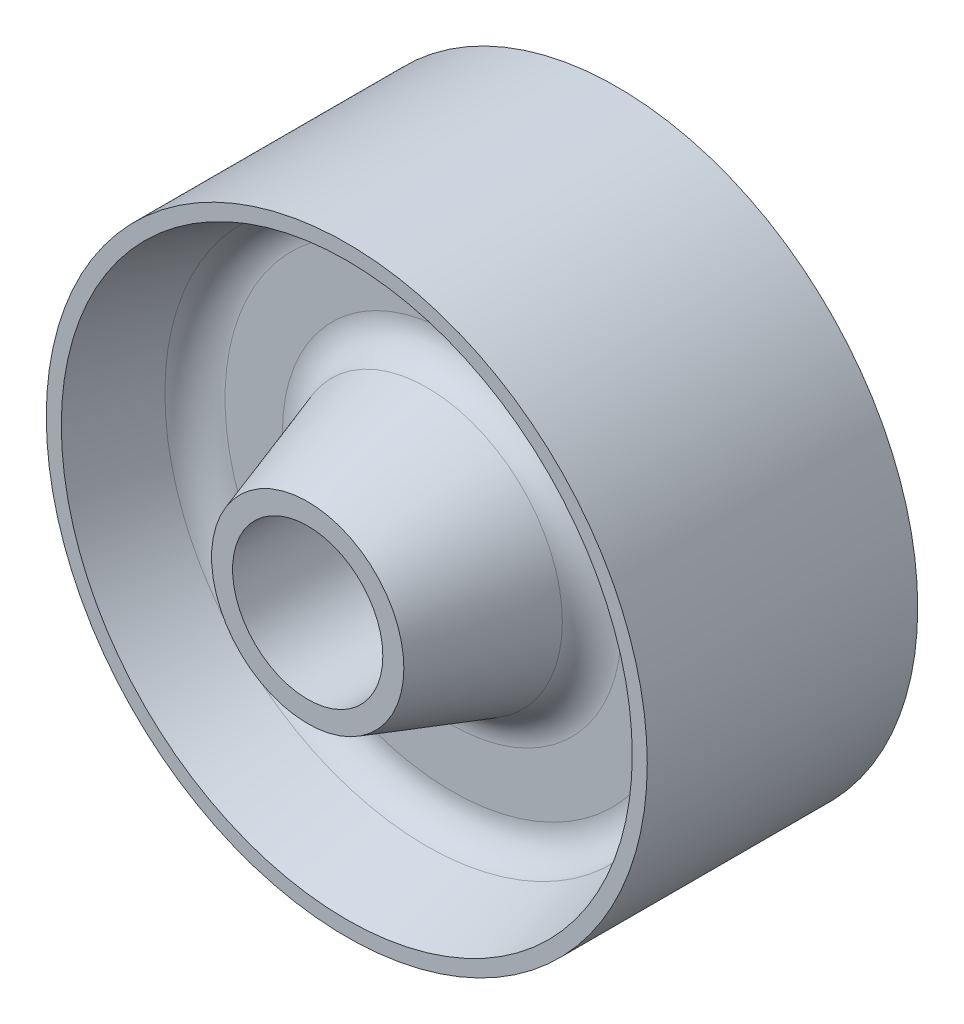
ISO-10303-21;
HEADER;
FILE_DESCRIPTION(('STEP AP214'),'2;1');
FILE_NAME('part.step','',(''),(''),'','','');
FILE_SCHEMA(('AUTOMOTIVE_DESIGN { 1 0 10303 214 1 1 1 1 }'));
ENDSEC;
DATA;
#1=APPLICATION_CONTEXT('core data for automotive mechanical design processes');
#2=APPLICATION_PROTOCOL_DEFINITION('international standard','automotive_design',2000,#1);
#3=PRODUCT_CONTEXT('',#1,'mechanical');
#4=PRODUCT('Part','Part','',(#3));
#5=PRODUCT_RELATED_PRODUCT_CATEGORY('part','',(#4));
#6=PRODUCT_DEFINITION_FORMATION('','',#4);
#7=PRODUCT_DEFINITION_CONTEXT('part definition',#1,'design');
#8=PRODUCT_DEFINITION('design','',#6,#7);
#9=PRODUCT_DEFINITION_SHAPE('','',#8);
#10=(LENGTH_UNIT() NAMED_UNIT(*) SI_UNIT(.MILLI.,.METRE.));
#11=(NAMED_UNIT(*) PLANE_ANGLE_UNIT() SI_UNIT($,.RADIAN.));
#12=(NAMED_UNIT(*) SI_UNIT($,.STERADIAN.) SOLID_ANGLE_UNIT());
#13=UNCERTAINTY_MEASURE_WITH_UNIT(LENGTH_MEASURE(1.E-05),#10,'distance_accuracy_value','');
#14=(GEOMETRIC_REPRESENTATION_CONTEXT(3) GLOBAL_UNCERTAINTY_ASSIGNED_CONTEXT((#13)) GLOBAL_UNIT_ASSIGNED_CONTEXT((#10,
#11,#12)) REPRESENTATION_CONTEXT('',''));
#15=CARTESIAN_POINT('',(0.,0.,0.));
#16=DIRECTION('',(0.,0.,1.));
#17=DIRECTION('',(1.,0.,0.));
#18=AXIS2_PLACEMENT_3D('',#15,#16,#17);
#19=CARTESIAN_POINT('',(0.,47.5,22.5));
#20=DIRECTION('',(0.,0.,-1.));
#21=DIRECTION('',(-1.,0.,0.));
#22=AXIS2_PLACEMENT_3D('',#19,#20,#21);
#23=PLANE('',#22);
#24=CARTESIAN_POINT('',(0.,0.,22.5));
#25=DIRECTION('',(0.,0.,1.));
#26=DIRECTION('',(1.,0.,0.));
#27=AXIS2_PLACEMENT_3D('',#24,#25,#26);
#28=CIRCLE('',#27,47.5);
#29=CARTESIAN_POINT('',(47.5,0.,22.5));
#30=VERTEX_POINT('',#29);
#31=EDGE_CURVE('E87',#30,#30,#28,.T.);
#32=ORIENTED_EDGE('',*,*,#31,.F.);
#33=EDGE_LOOP('',(#32));
#34=FACE_BOUND('',#33,.T.);
#35=CARTESIAN_POINT('',(0.,0.,22.5));
#36=DIRECTION('',(0.,0.,1.));
#37=DIRECTION('',(1.,0.,0.));
#38=AXIS2_PLACEMENT_3D('',#35,#36,#37);
#39=CIRCLE('',#38,50.);
#40=CARTESIAN_POINT('',(50.,0.,22.5));
#41=VERTEX_POINT('',#40);
#42=EDGE_CURVE('E10',#41,#41,#39,.T.);
#43=ORIENTED_EDGE('',*,*,#42,.T.);
#44=EDGE_LOOP('',(#43));
#45=FACE_BOUND('',#44,.T.);
#46=ADVANCED_FACE('F35',(#34,#45),#23,.F.);
#47=CARTESIAN_POINT('',(0.,0.,41.4443571183496));
#48=DIRECTION('',(0.,0.,1.));
#49=DIRECTION('',(1.,0.,0.));
#50=AXIS2_PLACEMENT_3D('',#47,#48,#49);
#51=CYLINDRICAL_SURFACE('',#50,50.);
#52=ORIENTED_EDGE('',*,*,#42,.F.);
#53=EDGE_LOOP('',(#52));
#54=FACE_BOUND('',#53,.T.);
#55=CARTESIAN_POINT('',(0.,0.,-22.5));
#56=DIRECTION('',(0.,0.,1.));
#57=DIRECTION('',(1.,0.,0.));
#58=AXIS2_PLACEMENT_3D('',#55,#56,#57);
#59=CIRCLE('',#58,50.);
#60=CARTESIAN_POINT('',(50.,0.,-22.5));
#61=VERTEX_POINT('',#60);
#62=EDGE_CURVE('E41',#61,#61,#59,.T.);
#63=ORIENTED_EDGE('',*,*,#62,.T.);
#64=EDGE_LOOP('',(#63));
#65=FACE_BOUND('',#64,.T.);
#66=ADVANCED_FACE('F94',(#54,#65),#51,.T.);
#67=CARTESIAN_POINT('',(0.,50.,-22.5));
#68=DIRECTION('',(0.,0.,1.));
#69=DIRECTION('',(1.,0.,0.));
#70=AXIS2_PLACEMENT_3D('',#67,#68,#69);
#71=PLANE('',#70);
#72=ORIENTED_EDGE('',*,*,#62,.F.);
#73=EDGE_LOOP('',(#72));
#74=FACE_BOUND('',#73,.T.);
#75=CARTESIAN_POINT('',(0.,0.,-22.5));
#76=DIRECTION('',(0.,0.,1.));
#77=DIRECTION('',(1.,0.,0.));
#78=AXIS2_PLACEMENT_3D('',#75,#76,#77);
#79=CIRCLE('',#78,47.5);
#80=CARTESIAN_POINT('',(47.5,0.,-22.5));
#81=VERTEX_POINT('',#80);
#82=EDGE_CURVE('E45',#81,#81,#79,.T.);
#83=ORIENTED_EDGE('',*,*,#82,.T.);
#84=EDGE_LOOP('',(#83));
#85=FACE_BOUND('',#84,.T.);
#86=ADVANCED_FACE('F98',(#74,#85),#71,.F.);
#87=CARTESIAN_POINT('',(0.,0.,-9.26426044901074));
#88=DIRECTION('',(0.,0.,-1.));
#89=DIRECTION('',(-1.,0.,0.));
#90=AXIS2_PLACEMENT_3D('',#87,#88,#89);
#91=CONICAL_SURFACE('',#90,43.5,0.293484961753605);
#92=ORIENTED_EDGE('',*,*,#82,.F.);
#93=EDGE_LOOP('',(#92));
#94=FACE_BOUND('',#93,.T.);
#95=CARTESIAN_POINT('',(0.,0.,-9.26426044901074));
#96=DIRECTION('',(0.,0.,1.));
#97=DIRECTION('',(1.,0.,0.));
#98=AXIS2_PLACEMENT_3D('',#95,#96,#97);
#99=CIRCLE('',#98,43.5);
#100=CARTESIAN_POINT('',(43.5,0.,-9.26426044901074));
#101=VERTEX_POINT('',#100);
#102=EDGE_CURVE('E49',#101,#101,#99,.T.);
#103=ORIENTED_EDGE('',*,*,#102,.T.);
#104=EDGE_LOOP('',(#103));
#105=FACE_BOUND('',#104,.T.);
#106=ADVANCED_FACE('F103',(#94,#105),#91,.F.);
#107=CARTESIAN_POINT('',(0.,0.,-11.));
#108=DIRECTION('',(0.,0.,1.));
#109=DIRECTION('',(1.,0.,0.));
#110=AXIS2_PLACEMENT_3D('',#107,#108,#109);
#111=TOROIDAL_SURFACE('',#110,37.7565508436888,6.);
#112=ORIENTED_EDGE('',*,*,#102,.F.);
#113=EDGE_LOOP('',(#112));
#114=FACE_BOUND('',#113,.T.);
#115=CARTESIAN_POINT('',(0.,0.,-4.99999999999999));
#116=DIRECTION('',(0.,0.,1.));
#117=DIRECTION('',(1.,0.,0.));
#118=AXIS2_PLACEMENT_3D('',#115,#116,#117);
#119=CIRCLE('',#118,37.7565508436888);
#120=CARTESIAN_POINT('',(37.7565508436888,0.,-4.99999999999999));
#121=VERTEX_POINT('',#120);
#122=EDGE_CURVE('E54',#121,#121,#119,.T.);
#123=ORIENTED_EDGE('',*,*,#122,.T.);
#124=EDGE_LOOP('',(#123));
#125=FACE_BOUND('',#124,.T.);
#126=ADVANCED_FACE('F109',(#114,#125),#111,.F.);
#127=CARTESIAN_POINT('',(0.,37.7565508436888,-5.));
#128=DIRECTION('',(0.,0.,1.));
#129=DIRECTION('',(1.,0.,0.));
#130=AXIS2_PLACEMENT_3D('',#127,#128,#129);
#131=PLANE('',#130);
#132=ORIENTED_EDGE('',*,*,#122,.F.);
#133=EDGE_LOOP('',(#132));
#134=FACE_BOUND('',#133,.T.);
#135=CARTESIAN_POINT('',(0.,0.,-5.));
#136=DIRECTION('',(0.,0.,1.));
#137=DIRECTION('',(1.,0.,0.));
#138=AXIS2_PLACEMENT_3D('',#135,#136,#137);
#139=CIRCLE('',#138,28.2025139085379);
#140=CARTESIAN_POINT('',(28.2025139085379,0.,-5.));
#141=VERTEX_POINT('',#140);
#142=EDGE_CURVE('E57',#141,#141,#139,.T.);
#143=ORIENTED_EDGE('',*,*,#142,.T.);
#144=EDGE_LOOP('',(#143));
#145=FACE_BOUND('',#144,.T.);
#146=ADVANCED_FACE('F113',(#134,#145),#131,.F.);
#147=CARTESIAN_POINT('',(0.,0.,-11.));
#148=DIRECTION('',(0.,0.,1.));
#149=DIRECTION('',(1.,0.,0.));
#150=AXIS2_PLACEMENT_3D('',#147,#148,#149);
#151=TOROIDAL_SURFACE('',#150,28.2025139085379,6.);
#152=ORIENTED_EDGE('',*,*,#142,.F.);
#153=EDGE_LOOP('',(#152));
#154=FACE_BOUND('',#153,.T.);
#155=CARTESIAN_POINT('',(0.,0.,-9.13416637319086));
#156=DIRECTION('',(0.,0.,1.));
#157=DIRECTION('',(1.,0.,0.));
#158=AXIS2_PLACEMENT_3D('',#155,#156,#157);
#159=CIRCLE('',#158,22.5);
#160=CARTESIAN_POINT('',(22.5,0.,-9.13416637319086));
#161=VERTEX_POINT('',#160);
#162=EDGE_CURVE('E60',#161,#161,#159,.T.);
#163=ORIENTED_EDGE('',*,*,#162,.T.);
#164=EDGE_LOOP('',(#163));
#165=FACE_BOUND('',#164,.T.);
#166=ADVANCED_FACE('F117',(#154,#165),#151,.F.);
#167=CARTESIAN_POINT('',(0.,0.,-29.));
#168=DIRECTION('',(0.,0.,1.));
#169=DIRECTION('',(1.,0.,0.));
#170=AXIS2_PLACEMENT_3D('',#167,#168,#169);
#171=CONICAL_SURFACE('',#170,16.,0.316215853592344);
#172=ORIENTED_EDGE('',*,*,#162,.F.);
#173=EDGE_LOOP('',(#172));
#174=FACE_BOUND('',#173,.T.);
#175=CARTESIAN_POINT('',(0.,0.,-29.));
#176=DIRECTION('',(0.,0.,1.));
#177=DIRECTION('',(1.,0.,0.));
#178=AXIS2_PLACEMENT_3D('',#175,#176,#177);
#179=CIRCLE('',#178,16.);
#180=CARTESIAN_POINT('',(16.,0.,-29.));
#181=VERTEX_POINT('',#180);
#182=EDGE_CURVE('E63',#181,#181,#179,.T.);
#183=ORIENTED_EDGE('',*,*,#182,.T.);
#184=EDGE_LOOP('',(#183));
#185=FACE_BOUND('',#184,.T.);
#186=ADVANCED_FACE('F121',(#174,#185),#171,.T.);
#187=CARTESIAN_POINT('',(0.,16.,-29.));
#188=DIRECTION('',(0.,0.,1.));
#189=DIRECTION('',(1.,0.,0.));
#190=AXIS2_PLACEMENT_3D('',#187,#188,#189);
#191=PLANE('',#190);
#192=ORIENTED_EDGE('',*,*,#182,.F.);
#193=EDGE_LOOP('',(#192));
#194=FACE_BOUND('',#193,.T.);
#195=CARTESIAN_POINT('',(0.,0.,-29.));
#196=DIRECTION('',(0.,0.,1.));
#197=DIRECTION('',(1.,0.,0.));
#198=AXIS2_PLACEMENT_3D('',#195,#196,#197);
#199=CIRCLE('',#198,12.5);
#200=CARTESIAN_POINT('',(12.5,0.,-29.));
#201=VERTEX_POINT('',#200);
#202=EDGE_CURVE('E66',#201,#201,#199,.T.);
#203=ORIENTED_EDGE('',*,*,#202,.T.);
#204=EDGE_LOOP('',(#203));
#205=FACE_BOUND('',#204,.T.);
#206=ADVANCED_FACE('F125',(#194,#205),#191,.F.);
#207=CARTESIAN_POINT('',(0.,0.,41.4443571183496));
#208=DIRECTION('',(0.,0.,1.));
#209=DIRECTION('',(1.,0.,0.));
#210=AXIS2_PLACEMENT_3D('',#207,#208,#209);
#211=CYLINDRICAL_SURFACE('',#210,12.5);
#212=ORIENTED_EDGE('',*,*,#202,.F.);
#213=EDGE_LOOP('',(#212));
#214=FACE_BOUND('',#213,.T.);
#215=CARTESIAN_POINT('',(0.,0.,29.));
#216=DIRECTION('',(0.,0.,1.));
#217=DIRECTION('',(1.,0.,0.));
#218=AXIS2_PLACEMENT_3D('',#215,#216,#217);
#219=CIRCLE('',#218,12.5);
#220=CARTESIAN_POINT('',(12.5,0.,29.));
#221=VERTEX_POINT('',#220);
#222=EDGE_CURVE('E69',#221,#221,#219,.T.);
#223=ORIENTED_EDGE('',*,*,#222,.T.);
#224=EDGE_LOOP('',(#223));
#225=FACE_BOUND('',#224,.T.);
#226=ADVANCED_FACE('F129',(#214,#225),#211,.F.);
#227=CARTESIAN_POINT('',(0.,12.5,29.));
#228=DIRECTION('',(0.,0.,-1.));
#229=DIRECTION('',(-1.,0.,0.));
#230=AXIS2_PLACEMENT_3D('',#227,#228,#229);
#231=PLANE('',#230);
#232=ORIENTED_EDGE('',*,*,#222,.F.);
#233=EDGE_LOOP('',(#232));
#234=FACE_BOUND('',#233,.T.);
#235=CARTESIAN_POINT('',(0.,0.,29.));
#236=DIRECTION('',(0.,0.,1.));
#237=DIRECTION('',(1.,0.,0.));
#238=AXIS2_PLACEMENT_3D('',#235,#236,#237);
#239=CIRCLE('',#238,16.);
#240=CARTESIAN_POINT('',(16.,0.,29.));
#241=VERTEX_POINT('',#240);
#242=EDGE_CURVE('E72',#241,#241,#239,.T.);
#243=ORIENTED_EDGE('',*,*,#242,.T.);
#244=EDGE_LOOP('',(#243));
#245=FACE_BOUND('',#244,.T.);
#246=ADVANCED_FACE('F133',(#234,#245),#231,.F.);
#247=CARTESIAN_POINT('',(0.,0.,9.13416637319086));
#248=DIRECTION('',(0.,0.,-1.));
#249=DIRECTION('',(-1.,0.,0.));
#250=AXIS2_PLACEMENT_3D('',#247,#248,#249);
#251=CONICAL_SURFACE('',#250,22.5,0.316215853592345);
#252=ORIENTED_EDGE('',*,*,#242,.F.);
#253=EDGE_LOOP('',(#252));
#254=FACE_BOUND('',#253,.T.);
#255=CARTESIAN_POINT('',(0.,0.,9.13416637319086));
#256=DIRECTION('',(0.,0.,1.));
#257=DIRECTION('',(1.,0.,0.));
#258=AXIS2_PLACEMENT_3D('',#255,#256,#257);
#259=CIRCLE('',#258,22.5);
#260=CARTESIAN_POINT('',(22.5,0.,9.13416637319086));
#261=VERTEX_POINT('',#260);
#262=EDGE_CURVE('E75',#261,#261,#259,.T.);
#263=ORIENTED_EDGE('',*,*,#262,.T.);
#264=EDGE_LOOP('',(#263));
#265=FACE_BOUND('',#264,.T.);
#266=ADVANCED_FACE('F137',(#254,#265),#251,.T.);
#267=CARTESIAN_POINT('',(0.,0.,11.));
#268=DIRECTION('',(0.,0.,1.));
#269=DIRECTION('',(1.,0.,0.));
#270=AXIS2_PLACEMENT_3D('',#267,#268,#269);
#271=TOROIDAL_SURFACE('',#270,28.2025139085379,6.);
#272=ORIENTED_EDGE('',*,*,#262,.F.);
#273=EDGE_LOOP('',(#272));
#274=FACE_BOUND('',#273,.T.);
#275=CARTESIAN_POINT('',(0.,0.,5.));
#276=DIRECTION('',(0.,0.,1.));
#277=DIRECTION('',(1.,0.,0.));
#278=AXIS2_PLACEMENT_3D('',#275,#276,#277);
#279=CIRCLE('',#278,28.2025139085379);
#280=CARTESIAN_POINT('',(28.2025139085379,0.,5.));
#281=VERTEX_POINT('',#280);
#282=EDGE_CURVE('E78',#281,#281,#279,.T.);
#283=ORIENTED_EDGE('',*,*,#282,.T.);
#284=EDGE_LOOP('',(#283));
#285=FACE_BOUND('',#284,.T.);
#286=ADVANCED_FACE('F141',(#274,#285),#271,.F.);
#287=CARTESIAN_POINT('',(0.,28.2025139085379,5.));
#288=DIRECTION('',(0.,0.,-1.));
#289=DIRECTION('',(-1.,0.,0.));
#290=AXIS2_PLACEMENT_3D('',#287,#288,#289);
#291=PLANE('',#290);
#292=ORIENTED_EDGE('',*,*,#282,.F.);
#293=EDGE_LOOP('',(#292));
#294=FACE_BOUND('',#293,.T.);
#295=CARTESIAN_POINT('',(0.,0.,5.));
#296=DIRECTION('',(0.,0.,1.));
#297=DIRECTION('',(1.,0.,0.));
#298=AXIS2_PLACEMENT_3D('',#295,#296,#297);
#299=CIRCLE('',#298,37.7565508436888);
#300=CARTESIAN_POINT('',(37.7565508436888,0.,5.));
#301=VERTEX_POINT('',#300);
#302=EDGE_CURVE('E81',#301,#301,#299,.T.);
#303=ORIENTED_EDGE('',*,*,#302,.T.);
#304=EDGE_LOOP('',(#303));
#305=FACE_BOUND('',#304,.T.);
#306=ADVANCED_FACE('F145',(#294,#305),#291,.F.);
#307=CARTESIAN_POINT('',(0.,0.,11.));
#308=DIRECTION('',(0.,0.,1.));
#309=DIRECTION('',(1.,0.,0.));
#310=AXIS2_PLACEMENT_3D('',#307,#308,#309);
#311=TOROIDAL_SURFACE('',#310,37.7565508436888,6.);
#312=ORIENTED_EDGE('',*,*,#302,.F.);
#313=EDGE_LOOP('',(#312));
#314=FACE_BOUND('',#313,.T.);
#315=CARTESIAN_POINT('',(0.,0.,9.26426044901076));
#316=DIRECTION('',(0.,0.,1.));
#317=DIRECTION('',(1.,0.,0.));
#318=AXIS2_PLACEMENT_3D('',#315,#316,#317);
#319=CIRCLE('',#318,43.5);
#320=CARTESIAN_POINT('',(43.5,0.,9.26426044901076));
#321=VERTEX_POINT('',#320);
#322=EDGE_CURVE('E84',#321,#321,#319,.T.);
#323=ORIENTED_EDGE('',*,*,#322,.T.);
#324=EDGE_LOOP('',(#323));
#325=FACE_BOUND('',#324,.T.);
#326=ADVANCED_FACE('F149',(#314,#325),#311,.F.);
#327=CARTESIAN_POINT('',(0.,0.,22.5));
#328=DIRECTION('',(0.,0.,1.));
#329=DIRECTION('',(1.,0.,0.));
#330=AXIS2_PLACEMENT_3D('',#327,#328,#329);
#331=CONICAL_SURFACE('',#330,47.5,0.293484961753604);
#332=ORIENTED_EDGE('',*,*,#322,.F.);
#333=EDGE_LOOP('',(#332));
#334=FACE_BOUND('',#333,.T.);
#335=ORIENTED_EDGE('',*,*,#31,.T.);
#336=EDGE_LOOP('',(#335));
#337=FACE_BOUND('',#336,.T.);
#338=ADVANCED_FACE('F91',(#334,#337),#331,.F.);
#339=CLOSED_SHELL('',(#46,#66,#86,#106,#126,#146,#166,#186,#206,#226,#246,#266,#286,#306,#326,#338));
#340=MANIFOLD_SOLID_BREP('B2',#339);
#341=ADVANCED_BREP_SHAPE_REPRESENTATION('',(#18,#340),#14);
#342=SHAPE_DEFINITION_REPRESENTATION(#9,#341);
ENDSEC;
END-ISO-10303-21;
